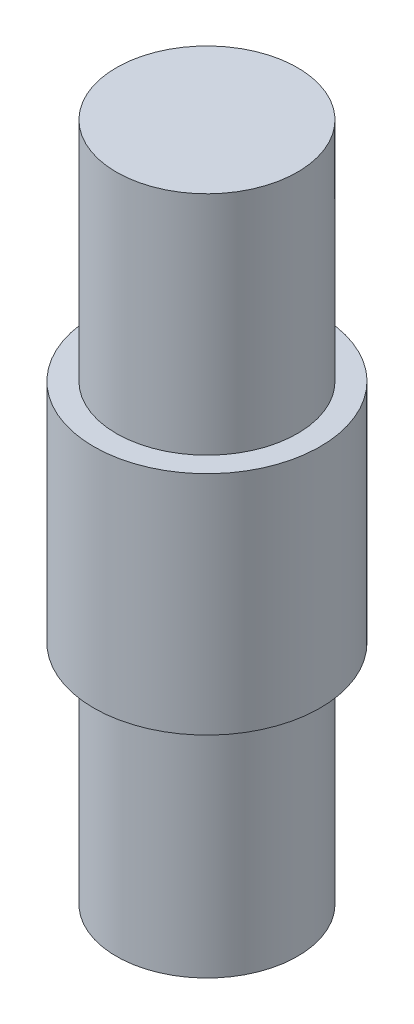
ISO-10303-21;
HEADER;
FILE_DESCRIPTION(('STEP AP214'),'2;1');
FILE_NAME('part.step','',(''),(''),'','','');
FILE_SCHEMA(('AUTOMOTIVE_DESIGN { 1 0 10303 214 1 1 1 1 }'));
ENDSEC;
DATA;
#1=APPLICATION_CONTEXT('core data for automotive mechanical design processes');
#2=APPLICATION_PROTOCOL_DEFINITION('international standard','automotive_design',2000,#1);
#3=PRODUCT_CONTEXT('',#1,'mechanical');
#4=PRODUCT('Part','Part','',(#3));
#5=PRODUCT_RELATED_PRODUCT_CATEGORY('part','',(#4));
#6=PRODUCT_DEFINITION_FORMATION('','',#4);
#7=PRODUCT_DEFINITION_CONTEXT('part definition',#1,'design');
#8=PRODUCT_DEFINITION('design','',#6,#7);
#9=PRODUCT_DEFINITION_SHAPE('','',#8);
#10=(LENGTH_UNIT() NAMED_UNIT(*) SI_UNIT(.MILLI.,.METRE.));
#11=(NAMED_UNIT(*) PLANE_ANGLE_UNIT() SI_UNIT($,.RADIAN.));
#12=(NAMED_UNIT(*) SI_UNIT($,.STERADIAN.) SOLID_ANGLE_UNIT());
#13=UNCERTAINTY_MEASURE_WITH_UNIT(LENGTH_MEASURE(1.E-05),#10,'distance_accuracy_value','');
#14=(GEOMETRIC_REPRESENTATION_CONTEXT(3) GLOBAL_UNCERTAINTY_ASSIGNED_CONTEXT((#13)) GLOBAL_UNIT_ASSIGNED_CONTEXT((#10,
#11,#12)) REPRESENTATION_CONTEXT('',''));
#15=CARTESIAN_POINT('',(0.,0.,0.));
#16=DIRECTION('',(0.,0.,1.));
#17=DIRECTION('',(1.,0.,0.));
#18=AXIS2_PLACEMENT_3D('',#15,#16,#17);
#19=CARTESIAN_POINT('',(0.,10.,0.));
#20=DIRECTION('',(0.,-1.,0.));
#21=DIRECTION('',(0.,0.,-1.));
#22=AXIS2_PLACEMENT_3D('',#19,#20,#21);
#23=CYLINDRICAL_SURFACE('',#22,5.);
#24=CARTESIAN_POINT('',(0.,10.,0.));
#25=DIRECTION('',(0.,1.,0.));
#26=DIRECTION('',(0.,0.,1.));
#27=AXIS2_PLACEMENT_3D('',#24,#25,#26);
#28=CIRCLE('',#27,5.);
#29=CARTESIAN_POINT('',(0.,10.,5.));
#30=VERTEX_POINT('',#29);
#31=EDGE_CURVE('E57',#30,#30,#28,.T.);
#32=ORIENTED_EDGE('',*,*,#31,.F.);
#33=EDGE_LOOP('',(#32));
#34=FACE_BOUND('',#33,.T.);
#35=CARTESIAN_POINT('',(0.,0.,0.));
#36=DIRECTION('',(0.,1.,0.));
#37=DIRECTION('',(0.,0.,1.));
#38=AXIS2_PLACEMENT_3D('',#35,#36,#37);
#39=CIRCLE('',#38,5.);
#40=CARTESIAN_POINT('',(0.,0.,5.));
#41=VERTEX_POINT('',#40);
#42=EDGE_CURVE('E46',#41,#41,#39,.T.);
#43=ORIENTED_EDGE('',*,*,#42,.T.);
#44=EDGE_LOOP('',(#43));
#45=FACE_BOUND('',#44,.T.);
#46=ADVANCED_FACE('F43',(#34,#45),#23,.T.);
#47=CARTESIAN_POINT('',(0.,10.,0.));
#48=DIRECTION('',(0.,1.,0.));
#49=DIRECTION('',(0.,0.,1.));
#50=AXIS2_PLACEMENT_3D('',#47,#48,#49);
#51=PLANE('',#50);
#52=CARTESIAN_POINT('',(0.,10.,0.));
#53=DIRECTION('',(0.,1.,0.));
#54=DIRECTION('',(0.,0.,1.));
#55=AXIS2_PLACEMENT_3D('',#52,#53,#54);
#56=CIRCLE('',#55,4.);
#57=CARTESIAN_POINT('',(0.,10.,4.));
#58=VERTEX_POINT('',#57);
#59=EDGE_CURVE('E51',#58,#58,#56,.T.);
#60=ORIENTED_EDGE('',*,*,#59,.F.);
#61=EDGE_LOOP('',(#60));
#62=FACE_BOUND('',#61,.T.);
#63=ORIENTED_EDGE('',*,*,#31,.T.);
#64=EDGE_LOOP('',(#63));
#65=FACE_BOUND('',#64,.T.);
#66=ADVANCED_FACE('F77',(#62,#65),#51,.T.);
#67=CARTESIAN_POINT('',(0.,0.,0.));
#68=DIRECTION('',(0.,1.,0.));
#69=DIRECTION('',(0.,0.,1.));
#70=AXIS2_PLACEMENT_3D('',#67,#68,#69);
#71=PLANE('',#70);
#72=CARTESIAN_POINT('',(0.,0.,0.));
#73=DIRECTION('',(0.,-1.,0.));
#74=DIRECTION('',(0.,0.,-1.));
#75=AXIS2_PLACEMENT_3D('',#72,#73,#74);
#76=CIRCLE('',#75,4.);
#77=CARTESIAN_POINT('',(0.,0.,-4.));
#78=VERTEX_POINT('',#77);
#79=EDGE_CURVE('E10',#78,#78,#76,.T.);
#80=ORIENTED_EDGE('',*,*,#79,.F.);
#81=EDGE_LOOP('',(#80));
#82=FACE_BOUND('',#81,.T.);
#83=ORIENTED_EDGE('',*,*,#42,.F.);
#84=EDGE_LOOP('',(#83));
#85=FACE_BOUND('',#84,.T.);
#86=ADVANCED_FACE('F74',(#82,#85),#71,.F.);
#87=CARTESIAN_POINT('',(0.,20.,0.));
#88=DIRECTION('',(0.,-1.,0.));
#89=DIRECTION('',(0.,0.,-1.));
#90=AXIS2_PLACEMENT_3D('',#87,#88,#89);
#91=CYLINDRICAL_SURFACE('',#90,4.);
#92=CARTESIAN_POINT('',(0.,20.,0.));
#93=DIRECTION('',(0.,1.,0.));
#94=DIRECTION('',(0.,0.,1.));
#95=AXIS2_PLACEMENT_3D('',#92,#93,#94);
#96=CIRCLE('',#95,4.);
#97=CARTESIAN_POINT('',(0.,20.,4.));
#98=VERTEX_POINT('',#97);
#99=EDGE_CURVE('E62',#98,#98,#96,.T.);
#100=ORIENTED_EDGE('',*,*,#99,.F.);
#101=EDGE_LOOP('',(#100));
#102=FACE_BOUND('',#101,.T.);
#103=ORIENTED_EDGE('',*,*,#59,.T.);
#104=EDGE_LOOP('',(#103));
#105=FACE_BOUND('',#104,.T.);
#106=ADVANCED_FACE('F76',(#102,#105),#91,.T.);
#107=CARTESIAN_POINT('',(0.,20.,0.));
#108=DIRECTION('',(0.,1.,0.));
#109=DIRECTION('',(0.,0.,1.));
#110=AXIS2_PLACEMENT_3D('',#107,#108,#109);
#111=PLANE('',#110);
#112=ORIENTED_EDGE('',*,*,#99,.T.);
#113=EDGE_LOOP('',(#112));
#114=FACE_BOUND('',#113,.T.);
#115=ADVANCED_FACE('F84',(#114),#111,.T.);
#116=CARTESIAN_POINT('',(0.,-10.,0.));
#117=DIRECTION('',(0.,1.,0.));
#118=DIRECTION('',(0.,0.,1.));
#119=AXIS2_PLACEMENT_3D('',#116,#117,#118);
#120=CYLINDRICAL_SURFACE('',#119,4.);
#121=CARTESIAN_POINT('',(0.,-10.,0.));
#122=DIRECTION('',(0.,-1.,0.));
#123=DIRECTION('',(0.,0.,-1.));
#124=AXIS2_PLACEMENT_3D('',#121,#122,#123);
#125=CIRCLE('',#124,4.);
#126=CARTESIAN_POINT('',(0.,-10.,-4.));
#127=VERTEX_POINT('',#126);
#128=EDGE_CURVE('E61',#127,#127,#125,.T.);
#129=ORIENTED_EDGE('',*,*,#128,.F.);
#130=EDGE_LOOP('',(#129));
#131=FACE_BOUND('',#130,.T.);
#132=ORIENTED_EDGE('',*,*,#79,.T.);
#133=EDGE_LOOP('',(#132));
#134=FACE_BOUND('',#133,.T.);
#135=ADVANCED_FACE('F109',(#131,#134),#120,.T.);
#136=CARTESIAN_POINT('',(0.,-10.,0.));
#137=DIRECTION('',(0.,-1.,0.));
#138=DIRECTION('',(0.,0.,-1.));
#139=AXIS2_PLACEMENT_3D('',#136,#137,#138);
#140=PLANE('',#139);
#141=ORIENTED_EDGE('',*,*,#128,.T.);
#142=EDGE_LOOP('',(#141));
#143=FACE_BOUND('',#142,.T.);
#144=ADVANCED_FACE('F121',(#143),#140,.T.);
#145=CLOSED_SHELL('',(#46,#66,#86,#106,#115,#135,#144));
#146=MANIFOLD_SOLID_BREP('B2',#145);
#147=ADVANCED_BREP_SHAPE_REPRESENTATION('',(#18,#146),#14);
#148=SHAPE_DEFINITION_REPRESENTATION(#9,#147);
ENDSEC;
END-ISO-10303-21;
